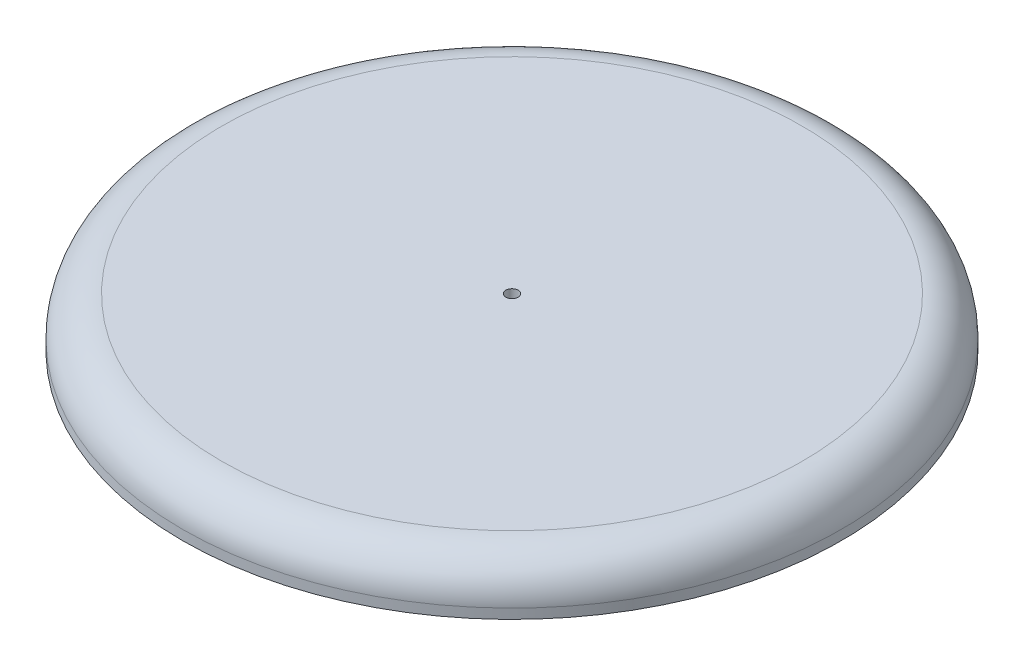
ISO-10303-21;
HEADER;
FILE_DESCRIPTION(('STEP AP214'),'2;1');
FILE_NAME('part.step','',(''),(''),'','','');
FILE_SCHEMA(('AUTOMOTIVE_DESIGN { 1 0 10303 214 1 1 1 1 }'));
ENDSEC;
DATA;
#1=APPLICATION_CONTEXT('core data for automotive mechanical design processes');
#2=APPLICATION_PROTOCOL_DEFINITION('international standard','automotive_design',2000,#1);
#3=PRODUCT_CONTEXT('',#1,'mechanical');
#4=PRODUCT('Part','Part','',(#3));
#5=PRODUCT_RELATED_PRODUCT_CATEGORY('part','',(#4));
#6=PRODUCT_DEFINITION_FORMATION('','',#4);
#7=PRODUCT_DEFINITION_CONTEXT('part definition',#1,'design');
#8=PRODUCT_DEFINITION('design','',#6,#7);
#9=PRODUCT_DEFINITION_SHAPE('','',#8);
#10=(LENGTH_UNIT() NAMED_UNIT(*) SI_UNIT(.MILLI.,.METRE.));
#11=(NAMED_UNIT(*) PLANE_ANGLE_UNIT() SI_UNIT($,.RADIAN.));
#12=(NAMED_UNIT(*) SI_UNIT($,.STERADIAN.) SOLID_ANGLE_UNIT());
#13=UNCERTAINTY_MEASURE_WITH_UNIT(LENGTH_MEASURE(1.E-05),#10,'distance_accuracy_value','');
#14=(GEOMETRIC_REPRESENTATION_CONTEXT(3) GLOBAL_UNCERTAINTY_ASSIGNED_CONTEXT((#13)) GLOBAL_UNIT_ASSIGNED_CONTEXT((#10,
#11,#12)) REPRESENTATION_CONTEXT('',''));
#15=CARTESIAN_POINT('',(0.,0.,0.));
#16=DIRECTION('',(0.,0.,1.));
#17=DIRECTION('',(1.,0.,0.));
#18=AXIS2_PLACEMENT_3D('',#15,#16,#17);
#19=CARTESIAN_POINT('',(0.,10.,0.));
#20=DIRECTION('',(0.,-1.,0.));
#21=DIRECTION('',(0.,0.,-1.));
#22=AXIS2_PLACEMENT_3D('',#19,#20,#21);
#23=CYLINDRICAL_SURFACE('',#22,67.15);
#24=CARTESIAN_POINT('',(0.,2.,0.));
#25=DIRECTION('',(0.,1.,0.));
#26=DIRECTION('',(0.,0.,1.));
#27=AXIS2_PLACEMENT_3D('',#24,#25,#26);
#28=CIRCLE('',#27,67.15);
#29=CARTESIAN_POINT('',(0.,2.,67.15));
#30=VERTEX_POINT('',#29);
#31=EDGE_CURVE('E10',#30,#30,#28,.F.);
#32=ORIENTED_EDGE('',*,*,#31,.T.);
#33=EDGE_LOOP('',(#32));
#34=FACE_BOUND('',#33,.T.);
#35=CARTESIAN_POINT('',(0.,0.,0.));
#36=DIRECTION('',(0.,1.,0.));
#37=DIRECTION('',(0.,0.,1.));
#38=AXIS2_PLACEMENT_3D('',#35,#36,#37);
#39=CIRCLE('',#38,67.15);
#40=CARTESIAN_POINT('',(0.,0.,67.15));
#41=VERTEX_POINT('',#40);
#42=EDGE_CURVE('E52',#41,#41,#39,.T.);
#43=ORIENTED_EDGE('',*,*,#42,.T.);
#44=EDGE_LOOP('',(#43));
#45=FACE_BOUND('',#44,.T.);
#46=ADVANCED_FACE('F39',(#34,#45),#23,.T.);
#47=CARTESIAN_POINT('',(0.,10.,0.));
#48=DIRECTION('',(0.,1.,0.));
#49=DIRECTION('',(0.,0.,1.));
#50=AXIS2_PLACEMENT_3D('',#47,#48,#49);
#51=PLANE('',#50);
#52=CARTESIAN_POINT('',(0.,10.,0.));
#53=DIRECTION('',(0.,1.,0.));
#54=DIRECTION('',(0.,0.,1.));
#55=AXIS2_PLACEMENT_3D('',#52,#53,#54);
#56=CIRCLE('',#55,1.25);
#57=CARTESIAN_POINT('',(0.,10.,1.25));
#58=VERTEX_POINT('',#57);
#59=EDGE_CURVE('E63',#58,#58,#56,.T.);
#60=ORIENTED_EDGE('',*,*,#59,.F.);
#61=EDGE_LOOP('',(#60));
#62=FACE_BOUND('',#61,.T.);
#63=CARTESIAN_POINT('',(0.,10.,0.));
#64=DIRECTION('',(0.,1.,0.));
#65=DIRECTION('',(0.,0.,1.));
#66=AXIS2_PLACEMENT_3D('',#63,#64,#65);
#67=CIRCLE('',#66,59.15);
#68=CARTESIAN_POINT('',(0.,10.,59.15));
#69=VERTEX_POINT('',#68);
#70=EDGE_CURVE('E47',#69,#69,#67,.T.);
#71=ORIENTED_EDGE('',*,*,#70,.T.);
#72=EDGE_LOOP('',(#71));
#73=FACE_BOUND('',#72,.T.);
#74=ADVANCED_FACE('F71',(#62,#73),#51,.T.);
#75=CARTESIAN_POINT('',(0.,0.,0.));
#76=DIRECTION('',(0.,1.,0.));
#77=DIRECTION('',(0.,0.,1.));
#78=AXIS2_PLACEMENT_3D('',#75,#76,#77);
#79=PLANE('',#78);
#80=CARTESIAN_POINT('',(0.,0.,0.));
#81=DIRECTION('',(0.,1.,0.));
#82=DIRECTION('',(0.,0.,1.));
#83=AXIS2_PLACEMENT_3D('',#80,#81,#82);
#84=CIRCLE('',#83,1.25);
#85=CARTESIAN_POINT('',(0.,0.,1.25));
#86=VERTEX_POINT('',#85);
#87=EDGE_CURVE('E57',#86,#86,#84,.F.);
#88=ORIENTED_EDGE('',*,*,#87,.F.);
#89=EDGE_LOOP('',(#88));
#90=FACE_BOUND('',#89,.T.);
#91=ORIENTED_EDGE('',*,*,#42,.F.);
#92=EDGE_LOOP('',(#91));
#93=FACE_BOUND('',#92,.T.);
#94=ADVANCED_FACE('F73',(#90,#93),#79,.F.);
#95=CARTESIAN_POINT('',(0.,2.,0.));
#96=DIRECTION('',(0.,1.,0.));
#97=DIRECTION('',(0.,0.,1.));
#98=AXIS2_PLACEMENT_3D('',#95,#96,#97);
#99=TOROIDAL_SURFACE('',#98,59.15,8.);
#100=ORIENTED_EDGE('',*,*,#31,.F.);
#101=EDGE_LOOP('',(#100));
#102=FACE_BOUND('',#101,.T.);
#103=ORIENTED_EDGE('',*,*,#70,.F.);
#104=EDGE_LOOP('',(#103));
#105=FACE_BOUND('',#104,.T.);
#106=ADVANCED_FACE('F41',(#102,#105),#99,.T.);
#107=CARTESIAN_POINT('',(0.,-0.000999999999999265,0.));
#108=DIRECTION('',(0.,1.,0.));
#109=DIRECTION('',(0.,0.,1.));
#110=AXIS2_PLACEMENT_3D('',#107,#108,#109);
#111=CYLINDRICAL_SURFACE('',#110,1.25);
#112=ORIENTED_EDGE('',*,*,#59,.T.);
#113=EDGE_LOOP('',(#112));
#114=FACE_BOUND('',#113,.T.);
#115=ORIENTED_EDGE('',*,*,#87,.T.);
#116=EDGE_LOOP('',(#115));
#117=FACE_BOUND('',#116,.T.);
#118=ADVANCED_FACE('F68',(#114,#117),#111,.F.);
#119=CLOSED_SHELL('',(#46,#74,#94,#106,#118));
#120=MANIFOLD_SOLID_BREP('B2',#119);
#121=ADVANCED_BREP_SHAPE_REPRESENTATION('',(#18,#120),#14);
#122=SHAPE_DEFINITION_REPRESENTATION(#9,#121);
ENDSEC;
END-ISO-10303-21;
